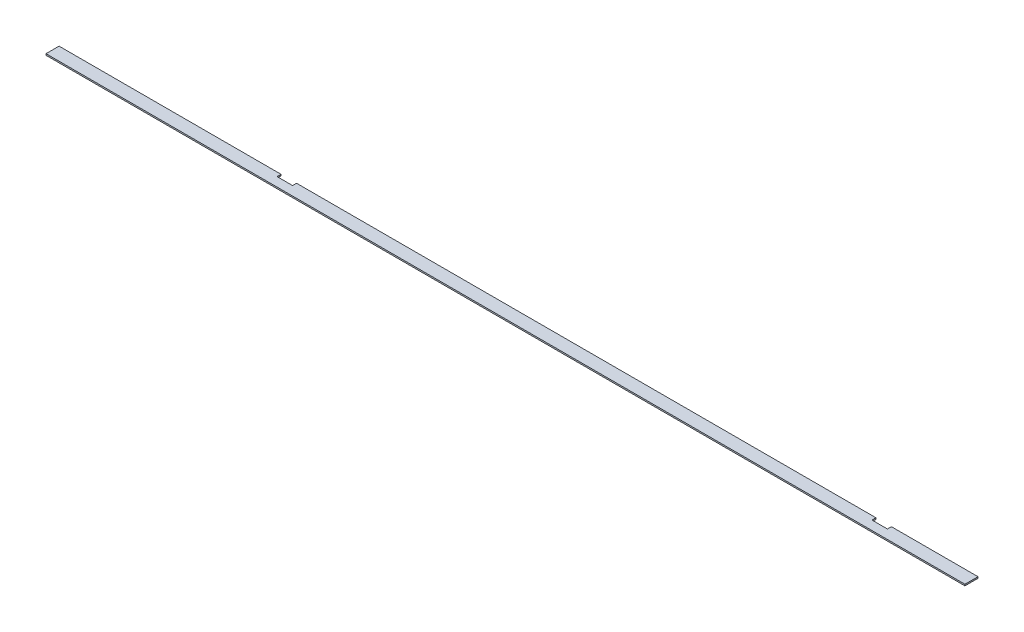
ISO-10303-21;
HEADER;
FILE_DESCRIPTION(('STEP AP214'),'2;1');
FILE_NAME('part.step','',(''),(''),'','','');
FILE_SCHEMA(('AUTOMOTIVE_DESIGN { 1 0 10303 214 1 1 1 1 }'));
ENDSEC;
DATA;
#1=APPLICATION_CONTEXT('core data for automotive mechanical design processes');
#2=APPLICATION_PROTOCOL_DEFINITION('international standard','automotive_design',2000,#1);
#3=PRODUCT_CONTEXT('',#1,'mechanical');
#4=PRODUCT('Part','Part','',(#3));
#5=PRODUCT_RELATED_PRODUCT_CATEGORY('part','',(#4));
#6=PRODUCT_DEFINITION_FORMATION('','',#4);
#7=PRODUCT_DEFINITION_CONTEXT('part definition',#1,'design');
#8=PRODUCT_DEFINITION('design','',#6,#7);
#9=PRODUCT_DEFINITION_SHAPE('','',#8);
#10=(LENGTH_UNIT() NAMED_UNIT(*) SI_UNIT(.MILLI.,.METRE.));
#11=(NAMED_UNIT(*) PLANE_ANGLE_UNIT() SI_UNIT($,.RADIAN.));
#12=(NAMED_UNIT(*) SI_UNIT($,.STERADIAN.) SOLID_ANGLE_UNIT());
#13=UNCERTAINTY_MEASURE_WITH_UNIT(LENGTH_MEASURE(1.E-05),#10,'distance_accuracy_value','');
#14=(GEOMETRIC_REPRESENTATION_CONTEXT(3) GLOBAL_UNCERTAINTY_ASSIGNED_CONTEXT((#13)) GLOBAL_UNIT_ASSIGNED_CONTEXT((#10,
#11,#12)) REPRESENTATION_CONTEXT('',''));
#15=CARTESIAN_POINT('',(0.,0.,0.));
#16=DIRECTION('',(0.,0.,1.));
#17=DIRECTION('',(1.,0.,0.));
#18=AXIS2_PLACEMENT_3D('',#15,#16,#17);
#19=CARTESIAN_POINT('',(-950.,3.,-13.4999999999999));
#20=DIRECTION('',(0.,0.,-1.));
#21=DIRECTION('',(-1.,0.,0.));
#22=AXIS2_PLACEMENT_3D('',#19,#20,#21);
#23=PLANE('',#22);
#24=DIRECTION('',(-1.,0.,0.));
#25=VECTOR('',#24,1.);
#26=CARTESIAN_POINT('',(-950.,3.,-13.4999999999999));
#27=LINE('',#26,#25);
#28=CARTESIAN_POINT('',(-491.000000000002,3.,-13.4999999999999));
#29=VERTEX_POINT('',#28);
#30=CARTESIAN_POINT('',(-950.,3.,-13.4999999999999));
#31=VERTEX_POINT('',#30);
#32=EDGE_CURVE('E192',#29,#31,#27,.T.);
#33=ORIENTED_EDGE('',*,*,#32,.F.);
#34=DIRECTION('',(0.,1.,0.));
#35=VECTOR('',#34,1.);
#36=CARTESIAN_POINT('',(-491.000000000002,3.,-13.4999999999999));
#37=LINE('',#36,#35);
#38=CARTESIAN_POINT('',(-491.000000000002,0.,-13.4999999999999));
#39=VERTEX_POINT('',#38);
#40=EDGE_CURVE('E130',#29,#39,#37,.F.);
#41=ORIENTED_EDGE('',*,*,#40,.T.);
#42=DIRECTION('',(1.,0.,0.));
#43=VECTOR('',#42,1.);
#44=CARTESIAN_POINT('',(-950.,0.,-13.4999999999999));
#45=LINE('',#44,#43);
#46=CARTESIAN_POINT('',(-950.,0.,-13.4999999999999));
#47=VERTEX_POINT('',#46);
#48=EDGE_CURVE('E203',#39,#47,#45,.F.);
#49=ORIENTED_EDGE('',*,*,#48,.T.);
#50=DIRECTION('',(0.,1.,0.));
#51=VECTOR('',#50,1.);
#52=CARTESIAN_POINT('',(-950.,3.,-13.4999999999999));
#53=LINE('',#52,#51);
#54=EDGE_CURVE('E209',#47,#31,#53,.T.);
#55=ORIENTED_EDGE('',*,*,#54,.T.);
#56=EDGE_LOOP('',(#33,#41,#49,#55));
#57=FACE_BOUND('',#56,.T.);
#58=ADVANCED_FACE('F35',(#57),#23,.T.);
#59=CARTESIAN_POINT('',(738.999999999998,0.,-13.4999999999999));
#60=VERTEX_POINT('',#59);
#61=CARTESIAN_POINT('',(-459.000000000002,0.,-13.4999999999999));
#62=VERTEX_POINT('',#61);
#63=EDGE_CURVE('E202',#60,#62,#45,.F.);
#64=ORIENTED_EDGE('',*,*,#63,.T.);
#65=DIRECTION('',(0.,1.,0.));
#66=VECTOR('',#65,1.);
#67=CARTESIAN_POINT('',(-459.000000000002,3.,-13.4999999999999));
#68=LINE('',#67,#66);
#69=CARTESIAN_POINT('',(-459.000000000002,3.,-13.4999999999999));
#70=VERTEX_POINT('',#69);
#71=EDGE_CURVE('E155',#70,#62,#68,.F.);
#72=ORIENTED_EDGE('',*,*,#71,.F.);
#73=CARTESIAN_POINT('',(738.999999999998,3.,-13.4999999999999));
#74=VERTEX_POINT('',#73);
#75=EDGE_CURVE('E196',#74,#70,#27,.T.);
#76=ORIENTED_EDGE('',*,*,#75,.F.);
#77=DIRECTION('',(0.,1.,0.));
#78=VECTOR('',#77,1.);
#79=CARTESIAN_POINT('',(738.999999999998,3.,-13.4999999999999));
#80=LINE('',#79,#78);
#81=EDGE_CURVE('E170',#74,#60,#80,.F.);
#82=ORIENTED_EDGE('',*,*,#81,.T.);
#83=EDGE_LOOP('',(#64,#72,#76,#82));
#84=FACE_BOUND('',#83,.T.);
#85=ADVANCED_FACE('F238',(#84),#23,.T.);
#86=CARTESIAN_POINT('',(-950.,3.,13.5000000000001));
#87=DIRECTION('',(0.,1.,0.));
#88=DIRECTION('',(0.,0.,1.));
#89=AXIS2_PLACEMENT_3D('',#86,#87,#88);
#90=PLANE('',#89);
#91=DIRECTION('',(1.,0.,0.));
#92=VECTOR('',#91,1.);
#93=CARTESIAN_POINT('',(-950.,3.,-5.24774203330427));
#94=LINE('',#93,#92);
#95=CARTESIAN_POINT('',(-491.000000000002,3.,-5.24774203330427));
#96=VERTEX_POINT('',#95);
#97=CARTESIAN_POINT('',(-459.000000000002,3.,-5.24774203330428));
#98=VERTEX_POINT('',#97);
#99=EDGE_CURVE('E138',#96,#98,#94,.T.);
#100=ORIENTED_EDGE('',*,*,#99,.F.);
#101=DIRECTION('',(0.,0.,1.));
#102=VECTOR('',#101,1.);
#103=CARTESIAN_POINT('',(-491.000000000002,3.,13.5000000000001));
#104=LINE('',#103,#102);
#105=EDGE_CURVE('E124',#29,#96,#104,.T.);
#106=ORIENTED_EDGE('',*,*,#105,.F.);
#107=ORIENTED_EDGE('',*,*,#32,.T.);
#108=DIRECTION('',(0.,0.,1.));
#109=VECTOR('',#108,1.);
#110=CARTESIAN_POINT('',(-950.,3.,-13.4999999999999));
#111=LINE('',#110,#109);
#112=CARTESIAN_POINT('',(-950.,3.,13.5000000000001));
#113=VERTEX_POINT('',#112);
#114=EDGE_CURVE('E182',#31,#113,#111,.T.);
#115=ORIENTED_EDGE('',*,*,#114,.T.);
#116=DIRECTION('',(1.,0.,0.));
#117=VECTOR('',#116,1.);
#118=CARTESIAN_POINT('',(-950.,3.,13.5000000000001));
#119=LINE('',#118,#117);
#120=CARTESIAN_POINT('',(950.,3.,13.5000000000001));
#121=VERTEX_POINT('',#120);
#122=EDGE_CURVE('E185',#113,#121,#119,.T.);
#123=ORIENTED_EDGE('',*,*,#122,.T.);
#124=DIRECTION('',(0.,0.,-1.));
#125=VECTOR('',#124,1.);
#126=CARTESIAN_POINT('',(950.,3.,-13.4999999999999));
#127=LINE('',#126,#125);
#128=CARTESIAN_POINT('',(950.,3.,-13.4999999999999));
#129=VERTEX_POINT('',#128);
#130=EDGE_CURVE('E189',#121,#129,#127,.T.);
#131=ORIENTED_EDGE('',*,*,#130,.T.);
#132=CARTESIAN_POINT('',(770.999999999998,3.,-13.4999999999999));
#133=VERTEX_POINT('',#132);
#134=EDGE_CURVE('E193',#129,#133,#27,.T.);
#135=ORIENTED_EDGE('',*,*,#134,.T.);
#136=DIRECTION('',(0.,0.,-1.));
#137=VECTOR('',#136,1.);
#138=CARTESIAN_POINT('',(770.999999999998,3.,13.5000000000001));
#139=LINE('',#138,#137);
#140=CARTESIAN_POINT('',(770.999999999998,3.,-5.24774203330466));
#141=VERTEX_POINT('',#140);
#142=EDGE_CURVE('E165',#141,#133,#139,.T.);
#143=ORIENTED_EDGE('',*,*,#142,.F.);
#144=DIRECTION('',(1.,0.,0.));
#145=VECTOR('',#144,1.);
#146=CARTESIAN_POINT('',(-950.,3.,-5.24774203330465));
#147=LINE('',#146,#145);
#148=CARTESIAN_POINT('',(738.999999999998,3.,-5.24774203330465));
#149=VERTEX_POINT('',#148);
#150=EDGE_CURVE('E158',#149,#141,#147,.T.);
#151=ORIENTED_EDGE('',*,*,#150,.F.);
#152=DIRECTION('',(0.,0.,1.));
#153=VECTOR('',#152,1.);
#154=CARTESIAN_POINT('',(738.999999999998,3.,13.5000000000001));
#155=LINE('',#154,#153);
#156=EDGE_CURVE('E174',#74,#149,#155,.T.);
#157=ORIENTED_EDGE('',*,*,#156,.F.);
#158=ORIENTED_EDGE('',*,*,#75,.T.);
#159=DIRECTION('',(0.,0.,-1.));
#160=VECTOR('',#159,1.);
#161=CARTESIAN_POINT('',(-459.000000000002,3.,13.5000000000001));
#162=LINE('',#161,#160);
#163=EDGE_CURVE('E135',#98,#70,#162,.T.);
#164=ORIENTED_EDGE('',*,*,#163,.F.);
#165=EDGE_LOOP('',(#100,#106,#107,#115,#123,#131,#135,#143,#151,#157,#158,#164));
#166=FACE_BOUND('',#165,.T.);
#167=ADVANCED_FACE('F143',(#166),#90,.T.);
#168=CARTESIAN_POINT('',(-950.,0.,13.5000000000001));
#169=DIRECTION('',(0.,1.,0.));
#170=DIRECTION('',(0.,0.,1.));
#171=AXIS2_PLACEMENT_3D('',#168,#169,#170);
#172=PLANE('',#171);
#173=DIRECTION('',(0.,0.,1.));
#174=VECTOR('',#173,1.);
#175=CARTESIAN_POINT('',(-491.000000000002,0.,13.5000000000001));
#176=LINE('',#175,#174);
#177=CARTESIAN_POINT('',(-491.000000000002,0.,-5.24774203330427));
#178=VERTEX_POINT('',#177);
#179=EDGE_CURVE('E149',#39,#178,#176,.T.);
#180=ORIENTED_EDGE('',*,*,#179,.T.);
#181=DIRECTION('',(1.,0.,0.));
#182=VECTOR('',#181,1.);
#183=CARTESIAN_POINT('',(-950.,0.,-5.24774203330411));
#184=LINE('',#183,#182);
#185=CARTESIAN_POINT('',(-459.000000000002,0.,-5.24774203330428));
#186=VERTEX_POINT('',#185);
#187=EDGE_CURVE('E140',#178,#186,#184,.T.);
#188=ORIENTED_EDGE('',*,*,#187,.T.);
#189=DIRECTION('',(0.,0.,1.));
#190=VECTOR('',#189,1.);
#191=CARTESIAN_POINT('',(-459.000000000002,0.,13.5000000000001));
#192=LINE('',#191,#190);
#193=EDGE_CURVE('E134',#186,#62,#192,.F.);
#194=ORIENTED_EDGE('',*,*,#193,.T.);
#195=ORIENTED_EDGE('',*,*,#63,.F.);
#196=DIRECTION('',(0.,0.,1.));
#197=VECTOR('',#196,1.);
#198=CARTESIAN_POINT('',(738.999999999998,0.,13.5000000000001));
#199=LINE('',#198,#197);
#200=CARTESIAN_POINT('',(738.999999999998,0.,-5.24774203330465));
#201=VERTEX_POINT('',#200);
#202=EDGE_CURVE('E167',#60,#201,#199,.T.);
#203=ORIENTED_EDGE('',*,*,#202,.T.);
#204=DIRECTION('',(1.,0.,0.));
#205=VECTOR('',#204,1.);
#206=CARTESIAN_POINT('',(-950.,0.,-5.24774203330406));
#207=LINE('',#206,#205);
#208=CARTESIAN_POINT('',(770.999999999998,0.,-5.24774203330467));
#209=VERTEX_POINT('',#208);
#210=EDGE_CURVE('E157',#201,#209,#207,.T.);
#211=ORIENTED_EDGE('',*,*,#210,.T.);
#212=DIRECTION('',(0.,0.,1.));
#213=VECTOR('',#212,1.);
#214=CARTESIAN_POINT('',(770.999999999998,0.,13.5000000000001));
#215=LINE('',#214,#213);
#216=CARTESIAN_POINT('',(770.999999999998,0.,-13.4999999999999));
#217=VERTEX_POINT('',#216);
#218=EDGE_CURVE('E171',#209,#217,#215,.F.);
#219=ORIENTED_EDGE('',*,*,#218,.T.);
#220=CARTESIAN_POINT('',(950.,0.,-13.4999999999999));
#221=VERTEX_POINT('',#220);
#222=EDGE_CURVE('E186',#221,#217,#45,.F.);
#223=ORIENTED_EDGE('',*,*,#222,.F.);
#224=DIRECTION('',(0.,0.,1.));
#225=VECTOR('',#224,1.);
#226=CARTESIAN_POINT('',(950.,0.,13.5000000000001));
#227=LINE('',#226,#225);
#228=CARTESIAN_POINT('',(950.,0.,13.5000000000001));
#229=VERTEX_POINT('',#228);
#230=EDGE_CURVE('E204',#229,#221,#227,.F.);
#231=ORIENTED_EDGE('',*,*,#230,.F.);
#232=DIRECTION('',(1.,0.,0.));
#233=VECTOR('',#232,1.);
#234=CARTESIAN_POINT('',(-950.,0.,13.5000000000001));
#235=LINE('',#234,#233);
#236=CARTESIAN_POINT('',(-950.,0.,13.5000000000001));
#237=VERTEX_POINT('',#236);
#238=EDGE_CURVE('E199',#237,#229,#235,.T.);
#239=ORIENTED_EDGE('',*,*,#238,.F.);
#240=DIRECTION('',(0.,0.,1.));
#241=VECTOR('',#240,1.);
#242=CARTESIAN_POINT('',(-950.,0.,13.5000000000001));
#243=LINE('',#242,#241);
#244=EDGE_CURVE('E181',#47,#237,#243,.T.);
#245=ORIENTED_EDGE('',*,*,#244,.F.);
#246=ORIENTED_EDGE('',*,*,#48,.F.);
#247=EDGE_LOOP('',(#180,#188,#194,#195,#203,#211,#219,#223,#231,#239,#245,#246));
#248=FACE_BOUND('',#247,.T.);
#249=ADVANCED_FACE('F226',(#248),#172,.F.);
#250=ORIENTED_EDGE('',*,*,#222,.T.);
#251=DIRECTION('',(0.,1.,0.));
#252=VECTOR('',#251,1.);
#253=CARTESIAN_POINT('',(770.999999999998,3.,-13.4999999999999));
#254=LINE('',#253,#252);
#255=EDGE_CURVE('E179',#133,#217,#254,.F.);
#256=ORIENTED_EDGE('',*,*,#255,.F.);
#257=ORIENTED_EDGE('',*,*,#134,.F.);
#258=DIRECTION('',(0.,1.,0.));
#259=VECTOR('',#258,1.);
#260=CARTESIAN_POINT('',(950.,3.,-13.4999999999999));
#261=LINE('',#260,#259);
#262=EDGE_CURVE('E44',#221,#129,#261,.T.);
#263=ORIENTED_EDGE('',*,*,#262,.F.);
#264=EDGE_LOOP('',(#250,#256,#257,#263));
#265=FACE_BOUND('',#264,.T.);
#266=ADVANCED_FACE('F222',(#265),#23,.T.);
#267=CARTESIAN_POINT('',(950.,3.,-13.4999999999999));
#268=DIRECTION('',(1.,0.,0.));
#269=DIRECTION('',(0.,0.,-1.));
#270=AXIS2_PLACEMENT_3D('',#267,#268,#269);
#271=PLANE('',#270);
#272=DIRECTION('',(0.,1.,0.));
#273=VECTOR('',#272,1.);
#274=CARTESIAN_POINT('',(950.,3.,13.5000000000001));
#275=LINE('',#274,#273);
#276=EDGE_CURVE('E11',#229,#121,#275,.T.);
#277=ORIENTED_EDGE('',*,*,#276,.F.);
#278=ORIENTED_EDGE('',*,*,#230,.T.);
#279=ORIENTED_EDGE('',*,*,#262,.T.);
#280=ORIENTED_EDGE('',*,*,#130,.F.);
#281=EDGE_LOOP('',(#277,#278,#279,#280));
#282=FACE_BOUND('',#281,.T.);
#283=ADVANCED_FACE('F214',(#282),#271,.T.);
#284=CARTESIAN_POINT('',(-950.,3.,-13.4999999999999));
#285=DIRECTION('',(-1.,0.,0.));
#286=DIRECTION('',(0.,0.,1.));
#287=AXIS2_PLACEMENT_3D('',#284,#285,#286);
#288=PLANE('',#287);
#289=ORIENTED_EDGE('',*,*,#54,.F.);
#290=ORIENTED_EDGE('',*,*,#244,.T.);
#291=DIRECTION('',(0.,1.,0.));
#292=VECTOR('',#291,1.);
#293=CARTESIAN_POINT('',(-950.,3.,13.5000000000001));
#294=LINE('',#293,#292);
#295=EDGE_CURVE('E39',#237,#113,#294,.T.);
#296=ORIENTED_EDGE('',*,*,#295,.T.);
#297=ORIENTED_EDGE('',*,*,#114,.F.);
#298=EDGE_LOOP('',(#289,#290,#296,#297));
#299=FACE_BOUND('',#298,.T.);
#300=ADVANCED_FACE('F245',(#299),#288,.T.);
#301=CARTESIAN_POINT('',(-950.,3.,13.5000000000001));
#302=DIRECTION('',(0.,0.,1.));
#303=DIRECTION('',(1.,0.,0.));
#304=AXIS2_PLACEMENT_3D('',#301,#302,#303);
#305=PLANE('',#304);
#306=ORIENTED_EDGE('',*,*,#238,.T.);
#307=ORIENTED_EDGE('',*,*,#276,.T.);
#308=ORIENTED_EDGE('',*,*,#122,.F.);
#309=ORIENTED_EDGE('',*,*,#295,.F.);
#310=EDGE_LOOP('',(#306,#307,#308,#309));
#311=FACE_BOUND('',#310,.T.);
#312=ADVANCED_FACE('F37',(#311),#305,.T.);
#313=CARTESIAN_POINT('',(738.999999999998,3.,13.5000000000001));
#314=DIRECTION('',(-1.,0.,0.));
#315=DIRECTION('',(0.,0.,1.));
#316=AXIS2_PLACEMENT_3D('',#313,#314,#315);
#317=PLANE('',#316);
#318=ORIENTED_EDGE('',*,*,#81,.F.);
#319=ORIENTED_EDGE('',*,*,#156,.T.);
#320=DIRECTION('',(0.,-1.,0.));
#321=VECTOR('',#320,1.);
#322=CARTESIAN_POINT('',(738.999999999998,0.,-5.24774203330465));
#323=LINE('',#322,#321);
#324=EDGE_CURVE('E162',#201,#149,#323,.F.);
#325=ORIENTED_EDGE('',*,*,#324,.F.);
#326=ORIENTED_EDGE('',*,*,#202,.F.);
#327=EDGE_LOOP('',(#318,#319,#325,#326));
#328=FACE_BOUND('',#327,.T.);
#329=ADVANCED_FACE('F232',(#328),#317,.F.);
#330=CARTESIAN_POINT('',(770.999999999998,3.,13.5000000000001));
#331=DIRECTION('',(1.,0.,0.));
#332=DIRECTION('',(0.,0.,-1.));
#333=AXIS2_PLACEMENT_3D('',#330,#331,#332);
#334=PLANE('',#333);
#335=ORIENTED_EDGE('',*,*,#142,.T.);
#336=ORIENTED_EDGE('',*,*,#255,.T.);
#337=ORIENTED_EDGE('',*,*,#218,.F.);
#338=DIRECTION('',(0.,-1.,0.));
#339=VECTOR('',#338,1.);
#340=CARTESIAN_POINT('',(770.999999999998,0.,-5.24774203330466));
#341=LINE('',#340,#339);
#342=EDGE_CURVE('E59',#209,#141,#341,.F.);
#343=ORIENTED_EDGE('',*,*,#342,.T.);
#344=EDGE_LOOP('',(#335,#336,#337,#343));
#345=FACE_BOUND('',#344,.T.);
#346=ADVANCED_FACE('F224',(#345),#334,.F.);
#347=CARTESIAN_POINT('',(-950.,0.,-5.24774203330406));
#348=DIRECTION('',(0.,0.,1.));
#349=DIRECTION('',(1.,0.,0.));
#350=AXIS2_PLACEMENT_3D('',#347,#348,#349);
#351=PLANE('',#350);
#352=ORIENTED_EDGE('',*,*,#210,.F.);
#353=ORIENTED_EDGE('',*,*,#324,.T.);
#354=ORIENTED_EDGE('',*,*,#150,.T.);
#355=ORIENTED_EDGE('',*,*,#342,.F.);
#356=EDGE_LOOP('',(#352,#353,#354,#355));
#357=FACE_BOUND('',#356,.T.);
#358=ADVANCED_FACE('F229',(#357),#351,.F.);
#359=CARTESIAN_POINT('',(-491.000000000002,3.,13.5000000000001));
#360=DIRECTION('',(-1.,0.,0.));
#361=DIRECTION('',(0.,0.,1.));
#362=AXIS2_PLACEMENT_3D('',#359,#360,#361);
#363=PLANE('',#362);
#364=ORIENTED_EDGE('',*,*,#40,.F.);
#365=ORIENTED_EDGE('',*,*,#105,.T.);
#366=DIRECTION('',(0.,-1.,0.));
#367=VECTOR('',#366,1.);
#368=CARTESIAN_POINT('',(-491.000000000002,0.,-5.24774203330427));
#369=LINE('',#368,#367);
#370=EDGE_CURVE('E127',#178,#96,#369,.F.);
#371=ORIENTED_EDGE('',*,*,#370,.F.);
#372=ORIENTED_EDGE('',*,*,#179,.F.);
#373=EDGE_LOOP('',(#364,#365,#371,#372));
#374=FACE_BOUND('',#373,.T.);
#375=ADVANCED_FACE('F126',(#374),#363,.F.);
#376=CARTESIAN_POINT('',(-459.000000000002,3.,13.5000000000001));
#377=DIRECTION('',(1.,0.,0.));
#378=DIRECTION('',(0.,0.,-1.));
#379=AXIS2_PLACEMENT_3D('',#376,#377,#378);
#380=PLANE('',#379);
#381=ORIENTED_EDGE('',*,*,#163,.T.);
#382=ORIENTED_EDGE('',*,*,#71,.T.);
#383=ORIENTED_EDGE('',*,*,#193,.F.);
#384=DIRECTION('',(0.,-1.,0.));
#385=VECTOR('',#384,1.);
#386=CARTESIAN_POINT('',(-459.000000000002,0.,-5.24774203330428));
#387=LINE('',#386,#385);
#388=EDGE_CURVE('E51',#186,#98,#387,.F.);
#389=ORIENTED_EDGE('',*,*,#388,.T.);
#390=EDGE_LOOP('',(#381,#382,#383,#389));
#391=FACE_BOUND('',#390,.T.);
#392=ADVANCED_FACE('F249',(#391),#380,.F.);
#393=CARTESIAN_POINT('',(-950.,0.,-5.24774203330411));
#394=DIRECTION('',(0.,0.,1.));
#395=DIRECTION('',(1.,0.,0.));
#396=AXIS2_PLACEMENT_3D('',#393,#394,#395);
#397=PLANE('',#396);
#398=ORIENTED_EDGE('',*,*,#187,.F.);
#399=ORIENTED_EDGE('',*,*,#370,.T.);
#400=ORIENTED_EDGE('',*,*,#99,.T.);
#401=ORIENTED_EDGE('',*,*,#388,.F.);
#402=EDGE_LOOP('',(#398,#399,#400,#401));
#403=FACE_BOUND('',#402,.T.);
#404=ADVANCED_FACE('F137',(#403),#397,.F.);
#405=CLOSED_SHELL('',(#58,#85,#167,#249,#266,#283,#300,#312,#329,#346,#358,#375,#392,#404));
#406=MANIFOLD_SOLID_BREP('B2',#405);
#407=ADVANCED_BREP_SHAPE_REPRESENTATION('',(#18,#406),#14);
#408=SHAPE_DEFINITION_REPRESENTATION(#9,#407);
ENDSEC;
END-ISO-10303-21;
